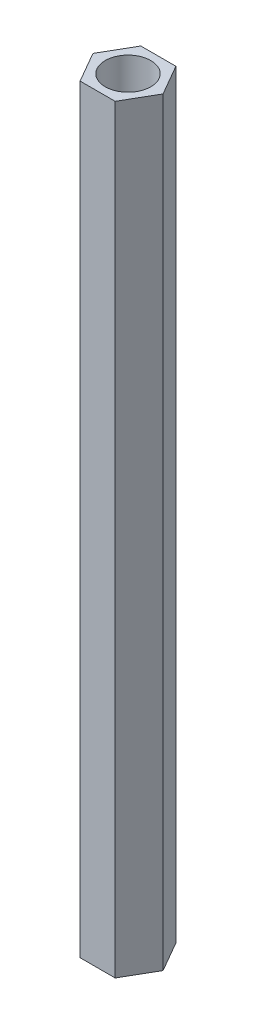
ISO-10303-21;
HEADER;
FILE_DESCRIPTION(('STEP AP214'),'2;1');
FILE_NAME('part.step','',(''),(''),'','','');
FILE_SCHEMA(('AUTOMOTIVE_DESIGN { 1 0 10303 214 1 1 1 1 }'));
ENDSEC;
DATA;
#1=APPLICATION_CONTEXT('core data for automotive mechanical design processes');
#2=APPLICATION_PROTOCOL_DEFINITION('international standard','automotive_design',2000,#1);
#3=PRODUCT_CONTEXT('',#1,'mechanical');
#4=PRODUCT('Part','Part','',(#3));
#5=PRODUCT_RELATED_PRODUCT_CATEGORY('part','',(#4));
#6=PRODUCT_DEFINITION_FORMATION('','',#4);
#7=PRODUCT_DEFINITION_CONTEXT('part definition',#1,'design');
#8=PRODUCT_DEFINITION('design','',#6,#7);
#9=PRODUCT_DEFINITION_SHAPE('','',#8);
#10=(LENGTH_UNIT() NAMED_UNIT(*) SI_UNIT(.MILLI.,.METRE.));
#11=(NAMED_UNIT(*) PLANE_ANGLE_UNIT() SI_UNIT($,.RADIAN.));
#12=(NAMED_UNIT(*) SI_UNIT($,.STERADIAN.) SOLID_ANGLE_UNIT());
#13=UNCERTAINTY_MEASURE_WITH_UNIT(LENGTH_MEASURE(1.E-05),#10,'distance_accuracy_value','');
#14=(GEOMETRIC_REPRESENTATION_CONTEXT(3) GLOBAL_UNCERTAINTY_ASSIGNED_CONTEXT((#13)) GLOBAL_UNIT_ASSIGNED_CONTEXT((#10,
#11,#12)) REPRESENTATION_CONTEXT('',''));
#15=CARTESIAN_POINT('',(0.,0.,0.));
#16=DIRECTION('',(0.,0.,1.));
#17=DIRECTION('',(1.,0.,0.));
#18=AXIS2_PLACEMENT_3D('',#15,#16,#17);
#19=CARTESIAN_POINT('',(1.15470053837925,50.,2.));
#20=DIRECTION('',(-0.866025403784439,0.,-0.5));
#21=DIRECTION('',(-0.5,0.,0.866025403784439));
#22=AXIS2_PLACEMENT_3D('',#19,#20,#21);
#23=PLANE('',#22);
#24=DIRECTION('',(0.5,0.,-0.866025403784439));
#25=VECTOR('',#24,1.);
#26=CARTESIAN_POINT('',(1.15470053837925,0.,2.));
#27=LINE('',#26,#25);
#28=CARTESIAN_POINT('',(1.15470053837925,0.,2.));
#29=VERTEX_POINT('',#28);
#30=CARTESIAN_POINT('',(2.3094010767585,0.,0.));
#31=VERTEX_POINT('',#30);
#32=EDGE_CURVE('E124',#29,#31,#27,.T.);
#33=ORIENTED_EDGE('',*,*,#32,.T.);
#34=DIRECTION('',(0.,-1.,0.));
#35=VECTOR('',#34,1.);
#36=CARTESIAN_POINT('',(2.3094010767585,50.,0.));
#37=LINE('',#36,#35);
#38=CARTESIAN_POINT('',(2.3094010767585,50.,0.));
#39=VERTEX_POINT('',#38);
#40=EDGE_CURVE('E11',#39,#31,#37,.T.);
#41=ORIENTED_EDGE('',*,*,#40,.F.);
#42=DIRECTION('',(0.5,0.,-0.866025403784439));
#43=VECTOR('',#42,1.);
#44=CARTESIAN_POINT('',(1.15470053837925,50.,2.));
#45=LINE('',#44,#43);
#46=CARTESIAN_POINT('',(1.15470053837925,50.,2.));
#47=VERTEX_POINT('',#46);
#48=EDGE_CURVE('E135',#47,#39,#45,.T.);
#49=ORIENTED_EDGE('',*,*,#48,.F.);
#50=DIRECTION('',(0.,-1.,0.));
#51=VECTOR('',#50,1.);
#52=CARTESIAN_POINT('',(1.15470053837925,50.,2.));
#53=LINE('',#52,#51);
#54=EDGE_CURVE('E120',#47,#29,#53,.T.);
#55=ORIENTED_EDGE('',*,*,#54,.T.);
#56=EDGE_LOOP('',(#33,#41,#49,#55));
#57=FACE_BOUND('',#56,.T.);
#58=ADVANCED_FACE('F40',(#57),#23,.F.);
#59=CARTESIAN_POINT('',(2.3094010767585,50.,0.));
#60=DIRECTION('',(-0.866025403784438,0.,0.5));
#61=DIRECTION('',(0.5,0.,0.866025403784439));
#62=AXIS2_PLACEMENT_3D('',#59,#60,#61);
#63=PLANE('',#62);
#64=DIRECTION('',(-0.5,0.,-0.866025403784438));
#65=VECTOR('',#64,1.);
#66=CARTESIAN_POINT('',(2.3094010767585,0.,0.));
#67=LINE('',#66,#65);
#68=CARTESIAN_POINT('',(1.15470053837925,0.,-2.));
#69=VERTEX_POINT('',#68);
#70=EDGE_CURVE('E127',#31,#69,#67,.T.);
#71=ORIENTED_EDGE('',*,*,#70,.T.);
#72=DIRECTION('',(0.,-1.,0.));
#73=VECTOR('',#72,1.);
#74=CARTESIAN_POINT('',(1.15470053837925,50.,-2.));
#75=LINE('',#74,#73);
#76=CARTESIAN_POINT('',(1.15470053837925,50.,-2.));
#77=VERTEX_POINT('',#76);
#78=EDGE_CURVE('E48',#77,#69,#75,.T.);
#79=ORIENTED_EDGE('',*,*,#78,.F.);
#80=DIRECTION('',(-0.5,0.,-0.866025403784438));
#81=VECTOR('',#80,1.);
#82=CARTESIAN_POINT('',(2.3094010767585,50.,0.));
#83=LINE('',#82,#81);
#84=EDGE_CURVE('E93',#39,#77,#83,.T.);
#85=ORIENTED_EDGE('',*,*,#84,.F.);
#86=ORIENTED_EDGE('',*,*,#40,.T.);
#87=EDGE_LOOP('',(#71,#79,#85,#86));
#88=FACE_BOUND('',#87,.T.);
#89=ADVANCED_FACE('F160',(#88),#63,.F.);
#90=CARTESIAN_POINT('',(1.15470053837925,50.,-2.));
#91=DIRECTION('',(0.,0.,1.));
#92=DIRECTION('',(1.,0.,0.));
#93=AXIS2_PLACEMENT_3D('',#90,#91,#92);
#94=PLANE('',#93);
#95=DIRECTION('',(-1.,0.,0.));
#96=VECTOR('',#95,1.);
#97=CARTESIAN_POINT('',(1.15470053837925,0.,-2.));
#98=LINE('',#97,#96);
#99=CARTESIAN_POINT('',(-1.15470053837925,0.,-2.));
#100=VERTEX_POINT('',#99);
#101=EDGE_CURVE('E130',#69,#100,#98,.T.);
#102=ORIENTED_EDGE('',*,*,#101,.T.);
#103=DIRECTION('',(0.,-1.,0.));
#104=VECTOR('',#103,1.);
#105=CARTESIAN_POINT('',(-1.15470053837925,50.,-2.));
#106=LINE('',#105,#104);
#107=CARTESIAN_POINT('',(-1.15470053837925,50.,-2.));
#108=VERTEX_POINT('',#107);
#109=EDGE_CURVE('E115',#108,#100,#106,.T.);
#110=ORIENTED_EDGE('',*,*,#109,.F.);
#111=DIRECTION('',(-1.,0.,0.));
#112=VECTOR('',#111,1.);
#113=CARTESIAN_POINT('',(1.15470053837925,50.,-2.));
#114=LINE('',#113,#112);
#115=EDGE_CURVE('E106',#77,#108,#114,.T.);
#116=ORIENTED_EDGE('',*,*,#115,.F.);
#117=ORIENTED_EDGE('',*,*,#78,.T.);
#118=EDGE_LOOP('',(#102,#110,#116,#117));
#119=FACE_BOUND('',#118,.T.);
#120=ADVANCED_FACE('F141',(#119),#94,.F.);
#121=CARTESIAN_POINT('',(-1.15470053837925,50.,-2.));
#122=DIRECTION('',(0.866025403784439,0.,0.5));
#123=DIRECTION('',(0.5,0.,-0.866025403784439));
#124=AXIS2_PLACEMENT_3D('',#121,#122,#123);
#125=PLANE('',#124);
#126=DIRECTION('',(-0.5,0.,0.866025403784439));
#127=VECTOR('',#126,1.);
#128=CARTESIAN_POINT('',(-1.15470053837925,0.,-2.));
#129=LINE('',#128,#127);
#130=CARTESIAN_POINT('',(-2.3094010767585,0.,0.));
#131=VERTEX_POINT('',#130);
#132=EDGE_CURVE('E114',#100,#131,#129,.T.);
#133=ORIENTED_EDGE('',*,*,#132,.T.);
#134=DIRECTION('',(0.,-1.,0.));
#135=VECTOR('',#134,1.);
#136=CARTESIAN_POINT('',(-2.3094010767585,50.,0.));
#137=LINE('',#136,#135);
#138=CARTESIAN_POINT('',(-2.3094010767585,50.,0.));
#139=VERTEX_POINT('',#138);
#140=EDGE_CURVE('E111',#139,#131,#137,.T.);
#141=ORIENTED_EDGE('',*,*,#140,.F.);
#142=DIRECTION('',(-0.5,0.,0.866025403784439));
#143=VECTOR('',#142,1.);
#144=CARTESIAN_POINT('',(-1.15470053837925,50.,-2.));
#145=LINE('',#144,#143);
#146=EDGE_CURVE('E100',#108,#139,#145,.T.);
#147=ORIENTED_EDGE('',*,*,#146,.F.);
#148=ORIENTED_EDGE('',*,*,#109,.T.);
#149=EDGE_LOOP('',(#133,#141,#147,#148));
#150=FACE_BOUND('',#149,.T.);
#151=ADVANCED_FACE('F112',(#150),#125,.F.);
#152=CARTESIAN_POINT('',(-2.3094010767585,50.,0.));
#153=DIRECTION('',(0.866025403784439,0.,-0.5));
#154=DIRECTION('',(-0.5,0.,-0.866025403784439));
#155=AXIS2_PLACEMENT_3D('',#152,#153,#154);
#156=PLANE('',#155);
#157=DIRECTION('',(0.5,0.,0.866025403784439));
#158=VECTOR('',#157,1.);
#159=CARTESIAN_POINT('',(-2.3094010767585,0.,0.));
#160=LINE('',#159,#158);
#161=CARTESIAN_POINT('',(-1.15470053837925,0.,2.));
#162=VERTEX_POINT('',#161);
#163=EDGE_CURVE('E79',#131,#162,#160,.T.);
#164=ORIENTED_EDGE('',*,*,#163,.T.);
#165=DIRECTION('',(0.,-1.,0.));
#166=VECTOR('',#165,1.);
#167=CARTESIAN_POINT('',(-1.15470053837925,50.,2.));
#168=LINE('',#167,#166);
#169=CARTESIAN_POINT('',(-1.15470053837925,50.,2.));
#170=VERTEX_POINT('',#169);
#171=EDGE_CURVE('E116',#170,#162,#168,.T.);
#172=ORIENTED_EDGE('',*,*,#171,.F.);
#173=DIRECTION('',(0.5,0.,0.866025403784439));
#174=VECTOR('',#173,1.);
#175=CARTESIAN_POINT('',(-2.3094010767585,50.,0.));
#176=LINE('',#175,#174);
#177=EDGE_CURVE('E104',#139,#170,#176,.T.);
#178=ORIENTED_EDGE('',*,*,#177,.F.);
#179=ORIENTED_EDGE('',*,*,#140,.T.);
#180=EDGE_LOOP('',(#164,#172,#178,#179));
#181=FACE_BOUND('',#180,.T.);
#182=ADVANCED_FACE('F118',(#181),#156,.F.);
#183=CARTESIAN_POINT('',(-1.15470053837925,50.,2.));
#184=DIRECTION('',(0.,0.,-1.));
#185=DIRECTION('',(-1.,0.,0.));
#186=AXIS2_PLACEMENT_3D('',#183,#184,#185);
#187=PLANE('',#186);
#188=DIRECTION('',(1.,0.,0.));
#189=VECTOR('',#188,1.);
#190=CARTESIAN_POINT('',(-1.15470053837925,0.,2.));
#191=LINE('',#190,#189);
#192=EDGE_CURVE('E85',#162,#29,#191,.T.);
#193=ORIENTED_EDGE('',*,*,#192,.T.);
#194=ORIENTED_EDGE('',*,*,#54,.F.);
#195=DIRECTION('',(1.,0.,0.));
#196=VECTOR('',#195,1.);
#197=CARTESIAN_POINT('',(-1.15470053837925,50.,2.));
#198=LINE('',#197,#196);
#199=EDGE_CURVE('E56',#170,#47,#198,.T.);
#200=ORIENTED_EDGE('',*,*,#199,.F.);
#201=ORIENTED_EDGE('',*,*,#171,.T.);
#202=EDGE_LOOP('',(#193,#194,#200,#201));
#203=FACE_BOUND('',#202,.T.);
#204=ADVANCED_FACE('F148',(#203),#187,.F.);
#205=CARTESIAN_POINT('',(0.,50.,0.));
#206=DIRECTION('',(0.,1.,0.));
#207=DIRECTION('',(0.,0.,1.));
#208=AXIS2_PLACEMENT_3D('',#205,#206,#207);
#209=PLANE('',#208);
#210=CARTESIAN_POINT('',(0.,50.,0.));
#211=DIRECTION('',(0.,1.,0.));
#212=DIRECTION('',(0.,0.,1.));
#213=AXIS2_PLACEMENT_3D('',#210,#211,#212);
#214=CIRCLE('',#213,1.5);
#215=CARTESIAN_POINT('',(0.,50.,1.5));
#216=VERTEX_POINT('',#215);
#217=EDGE_CURVE('E249',#216,#216,#214,.T.);
#218=ORIENTED_EDGE('',*,*,#217,.F.);
#219=EDGE_LOOP('',(#218));
#220=FACE_BOUND('',#219,.T.);
#221=ORIENTED_EDGE('',*,*,#48,.T.);
#222=ORIENTED_EDGE('',*,*,#84,.T.);
#223=ORIENTED_EDGE('',*,*,#115,.T.);
#224=ORIENTED_EDGE('',*,*,#146,.T.);
#225=ORIENTED_EDGE('',*,*,#177,.T.);
#226=ORIENTED_EDGE('',*,*,#199,.T.);
#227=EDGE_LOOP('',(#221,#222,#223,#224,#225,#226));
#228=FACE_BOUND('',#227,.T.);
#229=ADVANCED_FACE('F102',(#220,#228),#209,.T.);
#230=CARTESIAN_POINT('',(0.,0.,0.));
#231=DIRECTION('',(0.,1.,0.));
#232=DIRECTION('',(0.,0.,1.));
#233=AXIS2_PLACEMENT_3D('',#230,#231,#232);
#234=PLANE('',#233);
#235=CARTESIAN_POINT('',(0.,0.,0.));
#236=DIRECTION('',(0.,1.,0.));
#237=DIRECTION('',(0.,0.,1.));
#238=AXIS2_PLACEMENT_3D('',#235,#236,#237);
#239=CIRCLE('',#238,1.5);
#240=CARTESIAN_POINT('',(0.,0.,1.5));
#241=VERTEX_POINT('',#240);
#242=EDGE_CURVE('E128',#241,#241,#239,.T.);
#243=ORIENTED_EDGE('',*,*,#242,.T.);
#244=EDGE_LOOP('',(#243));
#245=FACE_BOUND('',#244,.T.);
#246=ORIENTED_EDGE('',*,*,#32,.F.);
#247=ORIENTED_EDGE('',*,*,#192,.F.);
#248=ORIENTED_EDGE('',*,*,#163,.F.);
#249=ORIENTED_EDGE('',*,*,#132,.F.);
#250=ORIENTED_EDGE('',*,*,#101,.F.);
#251=ORIENTED_EDGE('',*,*,#70,.F.);
#252=EDGE_LOOP('',(#246,#247,#248,#249,#250,#251));
#253=FACE_BOUND('',#252,.T.);
#254=ADVANCED_FACE('F144',(#245,#253),#234,.F.);
#255=CARTESIAN_POINT('',(0.,0.,0.));
#256=DIRECTION('',(0.,1.,0.));
#257=DIRECTION('',(0.,0.,1.));
#258=AXIS2_PLACEMENT_3D('',#255,#256,#257);
#259=CYLINDRICAL_SURFACE('',#258,1.5);
#260=ORIENTED_EDGE('',*,*,#242,.F.);
#261=EDGE_LOOP('',(#260));
#262=FACE_BOUND('',#261,.T.);
#263=ORIENTED_EDGE('',*,*,#217,.T.);
#264=EDGE_LOOP('',(#263));
#265=FACE_BOUND('',#264,.T.);
#266=ADVANCED_FACE('F202',(#262,#265),#259,.F.);
#267=CLOSED_SHELL('',(#58,#89,#120,#151,#182,#204,#229,#254,#266));
#268=MANIFOLD_SOLID_BREP('B2',#267);
#269=ADVANCED_BREP_SHAPE_REPRESENTATION('',(#18,#268),#14);
#270=SHAPE_DEFINITION_REPRESENTATION(#9,#269);
ENDSEC;
END-ISO-10303-21;
